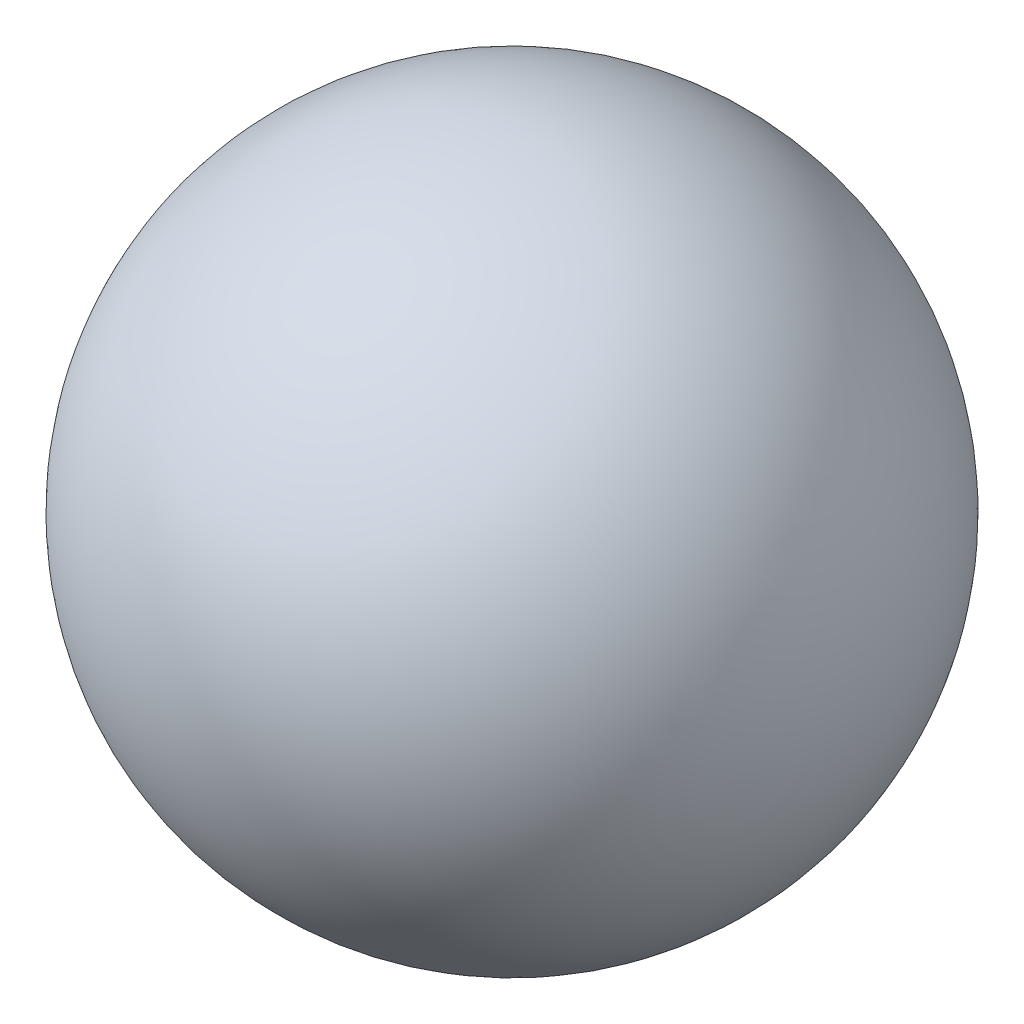
ISO-10303-21;
HEADER;
FILE_DESCRIPTION(('STEP AP214'),'2;1');
FILE_NAME('part.step','',(''),(''),'','','');
FILE_SCHEMA(('AUTOMOTIVE_DESIGN { 1 0 10303 214 1 1 1 1 }'));
ENDSEC;
DATA;
#1=APPLICATION_CONTEXT('core data for automotive mechanical design processes');
#2=APPLICATION_PROTOCOL_DEFINITION('international standard','automotive_design',2000,#1);
#3=PRODUCT_CONTEXT('',#1,'mechanical');
#4=PRODUCT('Part','Part','',(#3));
#5=PRODUCT_RELATED_PRODUCT_CATEGORY('part','',(#4));
#6=PRODUCT_DEFINITION_FORMATION('','',#4);
#7=PRODUCT_DEFINITION_CONTEXT('part definition',#1,'design');
#8=PRODUCT_DEFINITION('design','',#6,#7);
#9=PRODUCT_DEFINITION_SHAPE('','',#8);
#10=(LENGTH_UNIT() NAMED_UNIT(*) SI_UNIT(.MILLI.,.METRE.));
#11=(NAMED_UNIT(*) PLANE_ANGLE_UNIT() SI_UNIT($,.RADIAN.));
#12=(NAMED_UNIT(*) SI_UNIT($,.STERADIAN.) SOLID_ANGLE_UNIT());
#13=UNCERTAINTY_MEASURE_WITH_UNIT(LENGTH_MEASURE(1.E-05),#10,'distance_accuracy_value','');
#14=(GEOMETRIC_REPRESENTATION_CONTEXT(3) GLOBAL_UNCERTAINTY_ASSIGNED_CONTEXT((#13)) GLOBAL_UNIT_ASSIGNED_CONTEXT((#10,
#11,#12)) REPRESENTATION_CONTEXT('',''));
#15=CARTESIAN_POINT('',(0.,0.,0.));
#16=DIRECTION('',(0.,0.,1.));
#17=DIRECTION('',(1.,0.,0.));
#18=AXIS2_PLACEMENT_3D('',#15,#16,#17);
#19=CARTESIAN_POINT('',(-9.50745053634536,0.,-15.2674388174889));
#20=DIRECTION('',(-1.,0.,0.));
#21=DIRECTION('',(0.,0.,-1.));
#22=AXIS2_PLACEMENT_3D('',#19,#20,#21);
#23=SPHERICAL_SURFACE('',#22,30.);
#24=CARTESIAN_POINT('',(-39.5074505363454,0.,-15.2674388174889));
#25=VERTEX_POINT('',#24);
#26=VERTEX_LOOP('',#25);
#27=FACE_BOUND('',#26,.T.);
#28=ADVANCED_FACE('F40',(#27),#23,.T.);
#29=CLOSED_SHELL('',(#28));
#30=MANIFOLD_SOLID_BREP('B2',#29);
#31=ADVANCED_BREP_SHAPE_REPRESENTATION('',(#18,#30),#14);
#32=SHAPE_DEFINITION_REPRESENTATION(#9,#31);
ENDSEC;
END-ISO-10303-21;
